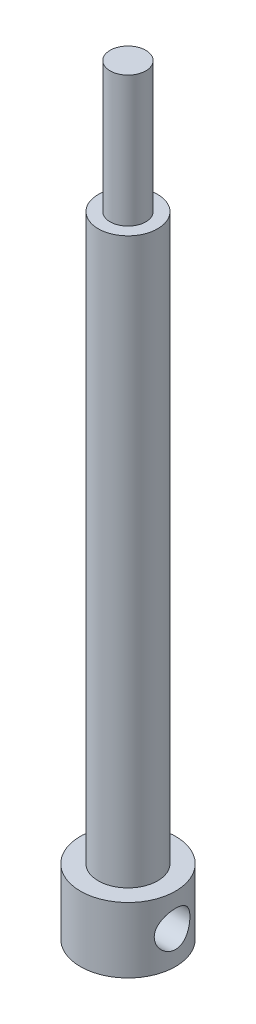
ISO-10303-21;
HEADER;
FILE_DESCRIPTION(('STEP AP214'),'2;1');
FILE_NAME('part.step','',(''),(''),'','','');
FILE_SCHEMA(('AUTOMOTIVE_DESIGN { 1 0 10303 214 1 1 1 1 }'));
ENDSEC;
DATA;
#1=APPLICATION_CONTEXT('core data for automotive mechanical design processes');
#2=APPLICATION_PROTOCOL_DEFINITION('international standard','automotive_design',2000,#1);
#3=PRODUCT_CONTEXT('',#1,'mechanical');
#4=PRODUCT('Part','Part','',(#3));
#5=PRODUCT_RELATED_PRODUCT_CATEGORY('part','',(#4));
#6=PRODUCT_DEFINITION_FORMATION('','',#4);
#7=PRODUCT_DEFINITION_CONTEXT('part definition',#1,'design');
#8=PRODUCT_DEFINITION('design','',#6,#7);
#9=PRODUCT_DEFINITION_SHAPE('','',#8);
#10=(LENGTH_UNIT() NAMED_UNIT(*) SI_UNIT(.MILLI.,.METRE.));
#11=(NAMED_UNIT(*) PLANE_ANGLE_UNIT() SI_UNIT($,.RADIAN.));
#12=(NAMED_UNIT(*) SI_UNIT($,.STERADIAN.) SOLID_ANGLE_UNIT());
#13=UNCERTAINTY_MEASURE_WITH_UNIT(LENGTH_MEASURE(1.E-05),#10,'distance_accuracy_value','');
#14=(GEOMETRIC_REPRESENTATION_CONTEXT(3) GLOBAL_UNCERTAINTY_ASSIGNED_CONTEXT((#13)) GLOBAL_UNIT_ASSIGNED_CONTEXT((#10,
#11,#12)) REPRESENTATION_CONTEXT('',''));
#15=CARTESIAN_POINT('',(0.,0.,0.));
#16=DIRECTION('',(0.,0.,1.));
#17=DIRECTION('',(1.,0.,0.));
#18=AXIS2_PLACEMENT_3D('',#15,#16,#17);
#19=CARTESIAN_POINT('',(0.,106.,0.));
#20=DIRECTION('',(0.,1.,0.));
#21=DIRECTION('',(0.,0.,1.));
#22=AXIS2_PLACEMENT_3D('',#19,#20,#21);
#23=PLANE('',#22);
#24=CARTESIAN_POINT('',(0.,106.,0.));
#25=DIRECTION('',(0.,1.,0.));
#26=DIRECTION('',(0.,0.,1.));
#27=AXIS2_PLACEMENT_3D('',#24,#25,#26);
#28=CIRCLE('',#27,3.);
#29=CARTESIAN_POINT('',(0.,106.,3.));
#30=VERTEX_POINT('',#29);
#31=EDGE_CURVE('E66',#30,#30,#28,.T.);
#32=ORIENTED_EDGE('',*,*,#31,.F.);
#33=EDGE_LOOP('',(#32));
#34=FACE_BOUND('',#33,.T.);
#35=CARTESIAN_POINT('',(0.,106.,0.));
#36=DIRECTION('',(0.,1.,0.));
#37=DIRECTION('',(0.,0.,1.));
#38=AXIS2_PLACEMENT_3D('',#35,#36,#37);
#39=CIRCLE('',#38,5.);
#40=CARTESIAN_POINT('',(0.,106.,5.));
#41=VERTEX_POINT('',#40);
#42=EDGE_CURVE('E110',#41,#41,#39,.T.);
#43=ORIENTED_EDGE('',*,*,#42,.T.);
#44=EDGE_LOOP('',(#43));
#45=FACE_BOUND('',#44,.T.);
#46=ADVANCED_FACE('F43',(#34,#45),#23,.T.);
#47=CARTESIAN_POINT('',(0.,106.,0.));
#48=DIRECTION('',(0.,1.,0.));
#49=DIRECTION('',(0.,0.,1.));
#50=AXIS2_PLACEMENT_3D('',#47,#48,#49);
#51=CYLINDRICAL_SURFACE('',#50,3.);
#52=ORIENTED_EDGE('',*,*,#31,.T.);
#53=EDGE_LOOP('',(#52));
#54=FACE_BOUND('',#53,.T.);
#55=CARTESIAN_POINT('',(0.,128.,0.));
#56=DIRECTION('',(0.,1.,0.));
#57=DIRECTION('',(0.,0.,1.));
#58=AXIS2_PLACEMENT_3D('',#55,#56,#57);
#59=CIRCLE('',#58,3.);
#60=CARTESIAN_POINT('',(0.,128.,3.));
#61=VERTEX_POINT('',#60);
#62=EDGE_CURVE('E115',#61,#61,#59,.T.);
#63=ORIENTED_EDGE('',*,*,#62,.F.);
#64=EDGE_LOOP('',(#63));
#65=FACE_BOUND('',#64,.T.);
#66=ADVANCED_FACE('F88',(#54,#65),#51,.T.);
#67=CARTESIAN_POINT('',(0.,128.,0.));
#68=DIRECTION('',(0.,1.,0.));
#69=DIRECTION('',(0.,0.,1.));
#70=AXIS2_PLACEMENT_3D('',#67,#68,#69);
#71=PLANE('',#70);
#72=ORIENTED_EDGE('',*,*,#62,.T.);
#73=EDGE_LOOP('',(#72));
#74=FACE_BOUND('',#73,.T.);
#75=ADVANCED_FACE('F86',(#74),#71,.T.);
#76=CARTESIAN_POINT('',(0.,-22.6274169979695,0.));
#77=DIRECTION('',(0.,1.,0.));
#78=DIRECTION('',(0.,0.,1.));
#79=AXIS2_PLACEMENT_3D('',#76,#77,#78);
#80=CYLINDRICAL_SURFACE('',#79,5.);
#81=CARTESIAN_POINT('',(0.,11.,0.));
#82=DIRECTION('',(0.,1.,0.));
#83=DIRECTION('',(0.,0.,1.));
#84=AXIS2_PLACEMENT_3D('',#81,#82,#83);
#85=CIRCLE('',#84,5.);
#86=CARTESIAN_POINT('',(0.,11.,5.));
#87=VERTEX_POINT('',#86);
#88=EDGE_CURVE('E109',#87,#87,#85,.F.);
#89=ORIENTED_EDGE('',*,*,#88,.F.);
#90=EDGE_LOOP('',(#89));
#91=FACE_BOUND('',#90,.T.);
#92=ORIENTED_EDGE('',*,*,#42,.F.);
#93=EDGE_LOOP('',(#92));
#94=FACE_BOUND('',#93,.T.);
#95=ADVANCED_FACE('F82',(#91,#94),#80,.T.);
#96=CARTESIAN_POINT('',(0.,11.,0.));
#97=DIRECTION('',(0.,1.,0.));
#98=DIRECTION('',(0.,0.,1.));
#99=AXIS2_PLACEMENT_3D('',#96,#97,#98);
#100=PLANE('',#99);
#101=CARTESIAN_POINT('',(0.,11.,0.));
#102=DIRECTION('',(0.,1.,0.));
#103=DIRECTION('',(0.,0.,1.));
#104=AXIS2_PLACEMENT_3D('',#101,#102,#103);
#105=CIRCLE('',#104,8.);
#106=CARTESIAN_POINT('',(0.,11.,8.));
#107=VERTEX_POINT('',#106);
#108=EDGE_CURVE('E107',#107,#107,#105,.F.);
#109=ORIENTED_EDGE('',*,*,#108,.F.);
#110=EDGE_LOOP('',(#109));
#111=FACE_BOUND('',#110,.T.);
#112=ORIENTED_EDGE('',*,*,#88,.T.);
#113=EDGE_LOOP('',(#112));
#114=FACE_BOUND('',#113,.T.);
#115=ADVANCED_FACE('F77',(#111,#114),#100,.T.);
#116=CARTESIAN_POINT('',(0.,0.,0.));
#117=DIRECTION('',(0.,1.,0.));
#118=DIRECTION('',(0.,0.,1.));
#119=AXIS2_PLACEMENT_3D('',#116,#117,#118);
#120=PLANE('',#119);
#121=CARTESIAN_POINT('',(0.,0.,0.));
#122=DIRECTION('',(0.,1.,0.));
#123=DIRECTION('',(0.,0.,1.));
#124=AXIS2_PLACEMENT_3D('',#121,#122,#123);
#125=CIRCLE('',#124,8.);
#126=CARTESIAN_POINT('',(0.,0.,8.));
#127=VERTEX_POINT('',#126);
#128=EDGE_CURVE('E61',#127,#127,#125,.T.);
#129=ORIENTED_EDGE('',*,*,#128,.F.);
#130=EDGE_LOOP('',(#129));
#131=FACE_BOUND('',#130,.T.);
#132=ADVANCED_FACE('F81',(#131),#120,.F.);
#133=CARTESIAN_POINT('',(0.,128.,0.));
#134=DIRECTION('',(0.,-1.,0.));
#135=DIRECTION('',(0.,0.,-1.));
#136=AXIS2_PLACEMENT_3D('',#133,#134,#135);
#137=CYLINDRICAL_SURFACE('',#136,8.);
#138=CARTESIAN_POINT('',(-8.,2.5,0.));
#139=CARTESIAN_POINT('',(-8.00000434912302,2.49999419539378,-0.162470117875706));
#140=CARTESIAN_POINT('',(-7.99500758566368,2.51323952049677,-0.324900483563584));
#141=CARTESIAN_POINT('',(-7.97557392013855,2.56565639053986,-0.644906904704722));
#142=CARTESIAN_POINT('',(-7.96113837787987,2.60482420094113,-0.802483655975232));
#143=CARTESIAN_POINT('',(-7.92437664783088,2.70750600354352,-1.10812156998176));
#144=CARTESIAN_POINT('',(-7.90206568698877,2.77097303364358,-1.25620044832455));
#145=CARTESIAN_POINT('',(-7.85177535530709,2.92021282603164,-1.53959862032051));
#146=CARTESIAN_POINT('',(-7.82379446455107,3.0059915710883,-1.67491447835576));
#147=CARTESIAN_POINT('',(-7.76372493942421,3.20122506214183,-1.93469283409165));
#148=CARTESIAN_POINT('',(-7.73152005167087,3.31146052451883,-2.05854146030237));
#149=CARTESIAN_POINT('',(-7.66720441742698,3.55082086931765,-2.28648842948728));
#150=CARTESIAN_POINT('',(-7.63509370270232,3.67995151217563,-2.39058072718411));
#151=CARTESIAN_POINT('',(-7.5732494123529,3.95943493504654,-2.57996404431964));
#152=CARTESIAN_POINT('',(-7.5436529764098,4.1104087330921,-2.66438786391495));
#153=CARTESIAN_POINT('',(-7.49199720475523,4.42569670833658,-2.80637292668193));
#154=CARTESIAN_POINT('',(-7.46993485954215,4.59000552630848,-2.86394489922567));
#155=CARTESIAN_POINT('',(-7.4370882564592,4.92023348051806,-2.94816862035013));
#156=CARTESIAN_POINT('',(-7.42587848693063,5.08581007687695,-2.97599186436803));
#157=CARTESIAN_POINT('',(-7.41476122931038,5.41963231598162,-3.00359113063608));
#158=CARTESIAN_POINT('',(-7.41484907350686,5.58787682772633,-3.00337873606425));
#159=CARTESIAN_POINT('',(-7.42595023233986,5.91153905045711,-2.97580859218857));
#160=CARTESIAN_POINT('',(-7.43630937632964,6.0671218121852,-2.95007617013711));
#161=CARTESIAN_POINT('',(-7.46569876010067,6.37157430090249,-2.87488335732475));
#162=CARTESIAN_POINT('',(-7.48473030568195,6.520443013249,-2.82541939325577));
#163=CARTESIAN_POINT('',(-7.52971404410467,6.81055413542651,-2.70327497145115));
#164=CARTESIAN_POINT('',(-7.55579035984378,6.95159897223456,-2.63017297474552));
#165=CARTESIAN_POINT('',(-7.61188420270589,7.21989147518999,-2.46312147525044));
#166=CARTESIAN_POINT('',(-7.64190308912093,7.34713435504162,-2.36916477457696));
#167=CARTESIAN_POINT('',(-7.70496077720597,7.59320732729938,-2.15563561533201));
#168=CARTESIAN_POINT('',(-7.73806694911977,7.71089728149555,-2.03476597433939));
#169=CARTESIAN_POINT('',(-7.80183456327535,7.92467593241223,-1.77462518163776));
#170=CARTESIAN_POINT('',(-7.83249562931732,8.02076130921152,-1.63535120699465));
#171=CARTESIAN_POINT('',(-7.88852789618334,8.18986079412487,-1.33944687398491));
#172=CARTESIAN_POINT('',(-7.91380996519278,8.26249516244208,-1.18258142768946));
#173=CARTESIAN_POINT('',(-7.95557436653878,8.37996520854013,-0.857673701049146));
#174=CARTESIAN_POINT('',(-7.97206060682974,8.42481323312225,-0.68963642169153));
#175=CARTESIAN_POINT('',(-7.99368886456142,8.48324557508387,-0.356750486297337));
#176=CARTESIAN_POINT('',(-7.99938738051376,8.49836521276502,-0.192207239124421));
#177=CARTESIAN_POINT('',(-8.00051787400248,8.50138212779984,0.137144950510049));
#178=CARTESIAN_POINT('',(-7.99595212773726,8.48928544063356,0.301953825966745));
#179=CARTESIAN_POINT('',(-7.97743419545287,8.43937991538266,0.620524097123718));
#180=CARTESIAN_POINT('',(-7.9638494192461,8.40257691252583,0.774466656014671));
#181=CARTESIAN_POINT('',(-7.92902954183434,8.30562785490536,1.07388350991444));
#182=CARTESIAN_POINT('',(-7.9077934456406,8.24547876410393,1.21935670069507));
#183=CARTESIAN_POINT('',(-7.85899248815363,8.10162717512105,1.50249553022031));
#184=CARTESIAN_POINT('',(-7.83126000418696,8.01728454155323,1.63980616711559));
#185=CARTESIAN_POINT('',(-7.77253343129328,7.82816379365689,1.89878542345325));
#186=CARTESIAN_POINT('',(-7.74153814019032,7.7233781349097,2.0204482405409));
#187=CARTESIAN_POINT('',(-7.67746658981979,7.48919175575145,2.25206159748908));
#188=CARTESIAN_POINT('',(-7.64437393007459,7.3587156344546,2.36092308247137));
#189=CARTESIAN_POINT('',(-7.58157631493707,7.08069723058469,2.55542100063806));
#190=CARTESIAN_POINT('',(-7.55187166388799,6.933153417223,2.64105534829037));
#191=CARTESIAN_POINT('',(-7.49933659644927,6.62396802645537,2.78675547037995));
#192=CARTESIAN_POINT('',(-7.47653520656987,6.46227050817913,2.84671370893836));
#193=CARTESIAN_POINT('',(-7.4410806578201,6.12998047262435,2.93815766933778));
#194=CARTESIAN_POINT('',(-7.42842122114981,5.95939352760375,2.9696610061107));
#195=CARTESIAN_POINT('',(-7.41551789585147,5.62596768091777,3.00172694195678));
#196=CARTESIAN_POINT('',(-7.41452889046682,5.46333473656623,3.00414662991675));
#197=CARTESIAN_POINT('',(-7.42316825490584,5.14010936744767,2.98273431283185));
#198=CARTESIAN_POINT('',(-7.43279561797798,4.97951675065683,2.95890479700247));
#199=CARTESIAN_POINT('',(-7.46096283170865,4.6699055465669,2.88711631260483));
#200=CARTESIAN_POINT('',(-7.47922170753326,4.52068330750931,2.83991596633048));
#201=CARTESIAN_POINT('',(-7.52243096595689,4.23218898301116,2.72339393559839));
#202=CARTESIAN_POINT('',(-7.54738303990429,4.09291942385971,2.65406665889889));
#203=CARTESIAN_POINT('',(-7.60279447807929,3.82034642060474,2.49104151876307));
#204=CARTESIAN_POINT('',(-7.63347396881928,3.68773840640018,2.3962566560602));
#205=CARTESIAN_POINT('',(-7.69612493514355,3.43971687805759,2.18668971459812));
#206=CARTESIAN_POINT('',(-7.7280968188629,3.3243088504265,2.07190128025616));
#207=CARTESIAN_POINT('',(-7.79180849219762,3.10759608835632,1.81816079356925));
#208=CARTESIAN_POINT('',(-7.82344209801289,3.00739249313065,1.67823728842598));
#209=CARTESIAN_POINT('',(-7.88109028914061,2.83195468944689,1.38242644640164));
#210=CARTESIAN_POINT('',(-7.90710443703118,2.75672242452726,1.22653786818124));
#211=CARTESIAN_POINT('',(-7.9514858521336,2.63124634190334,0.895998164004623));
#212=CARTESIAN_POINT('',(-7.96947314316712,2.58222587079621,0.720826844468416));
#213=CARTESIAN_POINT('',(-7.99372484359173,2.51661408015864,0.363751467212764));
#214=CARTESIAN_POINT('',(-7.99999513207934,2.50000649702535,0.181850832729718));
#215=CARTESIAN_POINT('',(-8.,2.5,0.));
#216=B_SPLINE_CURVE_WITH_KNOTS('',3,(#138,#139,#140,#141,#142,#143,#144,#145,#146,#147,#148,
#149,#150,#151,#152,#153,#154,#155,#156,#157,#158,#159,#160,#161,#162,#163,#164,#165,#166,#167,
#168,#169,#170,#171,#172,#173,#174,#175,#176,#177,#178,#179,#180,#181,#182,#183,#184,#185,#186,
#187,#188,#189,#190,#191,#192,#193,#194,#195,#196,#197,#198,#199,#200,#201,#202,#203,#204,#205,
#206,#207,#208,#209,#210,#211,#212,#213,#214,#215),.UNSPECIFIED.,.T.,.F.,(4,2,2,2,2,2,2,2,2,2,2,
2,2,2,2,2,2,2,2,2,2,2,2,2,2,2,2,2,2,2,2,2,2,2,2,2,2,2,4),(0.,0.486739603121119,
0.973409099060921,1.45914273842715,1.94500675921898,2.44947237165431,2.95409209851243,
3.47793349003317,4.00156538704267,4.50371748833803,5.00566212159414,5.47756690242935,
5.94954276126852,6.4304481677971,6.91151981494191,7.42492306677299,7.93840515815806,
8.45982750577824,8.98101799403365,9.47450039277525,9.96787336786715,10.4422887585335,
10.9167658651458,11.4051844372487,11.8937836004541,12.4107303891699,12.9277235784596,
13.4468613346008,13.9656774991869,14.4511752696618,14.9366270042819,15.4072628485874,
15.8780177331869,16.3734494377422,16.869038839998,17.3914465931375,17.9138949961588,
18.4589703006976,19.0037720359793),.UNSPECIFIED.);
#217=CARTESIAN_POINT('',(-8.,2.5,0.));
#218=VERTEX_POINT('',#217);
#219=EDGE_CURVE('E11',#218,#218,#216,.T.);
#220=ORIENTED_EDGE('',*,*,#219,.T.);
#221=EDGE_LOOP('',(#220));
#222=FACE_BOUND('',#221,.T.);
#223=CARTESIAN_POINT('',(7.41619848709566,5.5,-3.));
#224=CARTESIAN_POINT('',(7.41619281215226,5.3379850325166,-3.00000608211288));
#225=CARTESIAN_POINT('',(7.42156520296313,5.17601015487381,-2.98683195095364));
#226=CARTESIAN_POINT('',(7.44232318425766,4.85694383406478,-2.93472375787483));
#227=CARTESIAN_POINT('',(7.45770847484803,4.69985224478832,-2.89579046745932));
#228=CARTESIAN_POINT('',(7.49650960610891,4.39524925681117,-2.79379315222297));
#229=CARTESIAN_POINT('',(7.51990619151696,4.24771588670809,-2.73078694533005));
#230=CARTESIAN_POINT('',(7.57206268400018,3.96525620635206,-2.58263713485087));
#231=CARTESIAN_POINT('',(7.60082420131042,3.83033369943215,-2.49748688189993));
#232=CARTESIAN_POINT('',(7.66207149335192,3.5702193767573,-2.30293322748412));
#233=CARTESIAN_POINT('',(7.69466683848217,3.445742940742,-2.19260762426636));
#234=CARTESIAN_POINT('',(7.75899501256083,3.21655437065623,-1.95279167955761));
#235=CARTESIAN_POINT('',(7.79072765629295,3.11184645251608,-1.82329726051329));
#236=CARTESIAN_POINT('',(7.8510574787339,2.921720975409,-1.54338931035527));
#237=CARTESIAN_POINT('',(7.87951122447087,2.83708105056834,-1.39241389507607));
#238=CARTESIAN_POINT('',(7.92876015947619,2.69469765495012,-1.07711154393047));
#239=CARTESIAN_POINT('',(7.94955800433994,2.63694485601604,-0.912789261867064));
#240=CARTESIAN_POINT('',(7.98037394206897,2.55248420845078,-0.582978683353668));
#241=CARTESIAN_POINT('',(7.99081830429549,2.52454474511909,-0.417846394563195));
#242=CARTESIAN_POINT('',(8.0012802821588,2.49655759811003,-0.0849287275895653));
#243=CARTESIAN_POINT('',(8.0013012882982,2.4965008447626,0.0828557701256813));
#244=CARTESIAN_POINT('',(7.99118531807773,2.52356352293033,0.407487086128941));
#245=CARTESIAN_POINT('',(7.98155083993306,2.54933859589756,0.564464356533756));
#246=CARTESIAN_POINT('',(7.95386549864585,2.62507183045118,0.871678435968829));
#247=CARTESIAN_POINT('',(7.93581403951378,2.67503170452435,1.02191476686077));
#248=CARTESIAN_POINT('',(7.89275538334835,2.79834090335142,1.31397803460604));
#249=CARTESIAN_POINT('',(7.86765078939303,2.87202001053579,1.45565078457398));
#250=CARTESIAN_POINT('',(7.81302620451409,3.0403841938598,1.72497321591576));
#251=CARTESIAN_POINT('',(7.78350479028858,3.13507604603904,1.85261835386705));
#252=CARTESIAN_POINT('',(7.72105059308269,3.34925457256232,2.09818097359933));
#253=CARTESIAN_POINT('',(7.68801927514871,3.46986783128531,2.21509229051721));
#254=CARTESIAN_POINT('',(7.62364921304342,3.72918598665867,2.42740791139661));
#255=CARTESIAN_POINT('',(7.59231089545926,3.86789541323143,2.52280681389449));
#256=CARTESIAN_POINT('',(7.53425406951149,4.16343893487737,2.69131223613209));
#257=CARTESIAN_POINT('',(7.50765354114235,4.32060698717146,2.76387695690677));
#258=CARTESIAN_POINT('',(7.4634487707231,4.64619245012777,2.88112928869848));
#259=CARTESIAN_POINT('',(7.44583952363152,4.81460354312571,2.925832412077));
#260=CARTESIAN_POINT('',(7.42279194491541,5.14795192467549,2.98380383422378));
#261=CARTESIAN_POINT('',(7.41673570495336,5.31256821108394,2.99867042318746));
#262=CARTESIAN_POINT('',(7.41573079037772,5.64201871347183,3.00115771271731));
#263=CARTESIAN_POINT('',(7.42077934004762,5.80685286470189,2.9887852218731));
#264=CARTESIAN_POINT('',(7.44078763262529,6.12385984457827,2.93859467040517));
#265=CARTESIAN_POINT('',(7.45526552433718,6.2762622715301,2.90201236668503));
#266=CARTESIAN_POINT('',(7.49192974091902,6.57269588943961,2.80599549281221));
#267=CARTESIAN_POINT('',(7.51411764500121,6.71672535833606,2.74655624069231));
#268=CARTESIAN_POINT('',(7.56472486232391,6.99832887615263,2.60400584550571));
#269=CARTESIAN_POINT('',(7.59334657784192,7.13545858427474,2.52009090354097));
#270=CARTESIAN_POINT('',(7.6532562858852,7.39425796345202,2.33182635724954));
#271=CARTESIAN_POINT('',(7.68454525188137,7.51592194924925,2.22746927392868));
#272=CARTESIAN_POINT('',(7.74866093106387,7.74833674639021,1.99345468180189));
#273=CARTESIAN_POINT('',(7.7814593871406,7.85790681753751,1.86261268298213));
#274=CARTESIAN_POINT('',(7.84299749926599,8.05367673517887,1.5835949435063));
#275=CARTESIAN_POINT('',(7.87173714215327,8.13987650589168,1.43541914664534));
#276=CARTESIAN_POINT('',(7.92189971409105,8.28589211239922,1.12603265893695));
#277=CARTESIAN_POINT('',(7.9433476267602,8.34579824758521,0.964868866129251));
#278=CARTESIAN_POINT('',(7.97658873425142,8.43731282769984,0.633763775046506));
#279=CARTESIAN_POINT('',(7.98838646598825,8.4689345708448,0.463826641447183));
#280=CARTESIAN_POINT('',(8.00056814634147,8.50154880550965,0.130671170547629));
#281=CARTESIAN_POINT('',(8.00157721907528,8.50421896611798,-0.0323615361216919));
#282=CARTESIAN_POINT('',(7.99369779618447,8.48316968110921,-0.356453572824849));
#283=CARTESIAN_POINT('',(7.98481049426262,8.45945341822829,-0.517513138490516));
#284=CARTESIAN_POINT('',(7.95842179207541,8.38748229701276,-0.829096496754254));
#285=CARTESIAN_POINT('',(7.9411358275603,8.33984018824328,-0.97978146213767));
#286=CARTESIAN_POINT('',(7.89975567241984,8.22197997323128,-1.27103094601278));
#287=CARTESIAN_POINT('',(7.87566019311345,8.1517575933905,-1.41159354255109));
#288=CARTESIAN_POINT('',(7.8218123660013,7.98737211299037,-1.68508035398882));
#289=CARTESIAN_POINT('',(7.79186480217587,7.89232671897167,-1.81743509769369));
#290=CARTESIAN_POINT('',(7.72999015389759,7.68238433962482,-2.06483469504674));
#291=CARTESIAN_POINT('',(7.69806236548317,7.56748026838436,-2.17987334251185));
#292=CARTESIAN_POINT('',(7.63376259478074,7.31387173670976,-2.39562428472386));
#293=CARTESIAN_POINT('',(7.60145610697262,7.17423119569092,-2.49525999632032));
#294=CARTESIAN_POINT('',(7.54196650008334,6.87916826085381,-2.66969419113705));
#295=CARTESIAN_POINT('',(7.51478391266386,6.72374423189476,-2.74449009756384));
#296=CARTESIAN_POINT('',(7.46804539702406,6.39408863804739,-2.86931773948447));
#297=CARTESIAN_POINT('',(7.44887606566003,6.21933126696959,-2.91812005798766));
#298=CARTESIAN_POINT('',(7.42295988688337,5.86302945609526,-2.98344713444437));
#299=CARTESIAN_POINT('',(7.41620484418155,5.68148957460557,-2.99999318680184));
#300=CARTESIAN_POINT('',(7.41619848709566,5.5,-3.));
#301=B_SPLINE_CURVE_WITH_KNOTS('',3,(#223,#224,#225,#226,#227,#228,#229,#230,#231,#232,#233,
#234,#235,#236,#237,#238,#239,#240,#241,#242,#243,#244,#245,#246,#247,#248,#249,#250,#251,#252,
#253,#254,#255,#256,#257,#258,#259,#260,#261,#262,#263,#264,#265,#266,#267,#268,#269,#270,#271,
#272,#273,#274,#275,#276,#277,#278,#279,#280,#281,#282,#283,#284,#285,#286,#287,#288,#289,#290,
#291,#292,#293,#294,#295,#296,#297,#298,#299,#300),.UNSPECIFIED.,.T.,.F.,(4,2,2,2,2,2,2,2,2,2,2,
2,2,2,2,2,2,2,2,2,2,2,2,2,2,2,2,2,2,2,2,2,2,2,2,2,2,2,4),(0.,0.485369082889299,0.97072362930767,
1.45491971362402,1.93926135947583,2.44549304813252,2.95183257656962,3.47540144283838,
3.99878852773656,4.49960036990354,5.0002493082071,5.47612945617385,5.95204330537667,
6.43488262432332,6.91787787268947,7.42913350142745,7.94051735665666,8.46325184520833,
8.98569503290589,9.47931315500611,9.97280790797409,10.4428769187604,10.9130422687869,
11.4008312203128,11.8887989695235,12.4077003400689,12.9266033932,13.4437101779998,
13.9605737113989,14.4473144111951,14.933996406586,15.4088054802742,15.883704470453,
16.3785664737361,16.8736054180957,17.394771991038,17.9159926110812,18.4600635776149,
19.0037752466575),.UNSPECIFIED.);
#302=CARTESIAN_POINT('',(7.41619848709566,5.5,-3.));
#303=VERTEX_POINT('',#302);
#304=EDGE_CURVE('E56',#303,#303,#301,.T.);
#305=ORIENTED_EDGE('',*,*,#304,.T.);
#306=EDGE_LOOP('',(#305));
#307=FACE_BOUND('',#306,.T.);
#308=ORIENTED_EDGE('',*,*,#128,.T.);
#309=EDGE_LOOP('',(#308));
#310=FACE_BOUND('',#309,.T.);
#311=ORIENTED_EDGE('',*,*,#108,.T.);
#312=EDGE_LOOP('',(#311));
#313=FACE_BOUND('',#312,.T.);
#314=ADVANCED_FACE('F45',(#222,#307,#310,#313),#137,.T.);
#315=CARTESIAN_POINT('',(-8.,5.5,0.));
#316=DIRECTION('',(1.,0.,0.));
#317=DIRECTION('',(0.,0.,-1.));
#318=AXIS2_PLACEMENT_3D('',#315,#316,#317);
#319=CYLINDRICAL_SURFACE('',#318,3.);
#320=ORIENTED_EDGE('',*,*,#304,.F.);
#321=EDGE_LOOP('',(#320));
#322=FACE_BOUND('',#321,.T.);
#323=ORIENTED_EDGE('',*,*,#219,.F.);
#324=EDGE_LOOP('',(#323));
#325=FACE_BOUND('',#324,.T.);
#326=ADVANCED_FACE('F72',(#322,#325),#319,.F.);
#327=CLOSED_SHELL('',(#46,#66,#75,#95,#115,#132,#314,#326));
#328=MANIFOLD_SOLID_BREP('B2',#327);
#329=ADVANCED_BREP_SHAPE_REPRESENTATION('',(#18,#328),#14);
#330=SHAPE_DEFINITION_REPRESENTATION(#9,#329);
ENDSEC;
END-ISO-10303-21;
